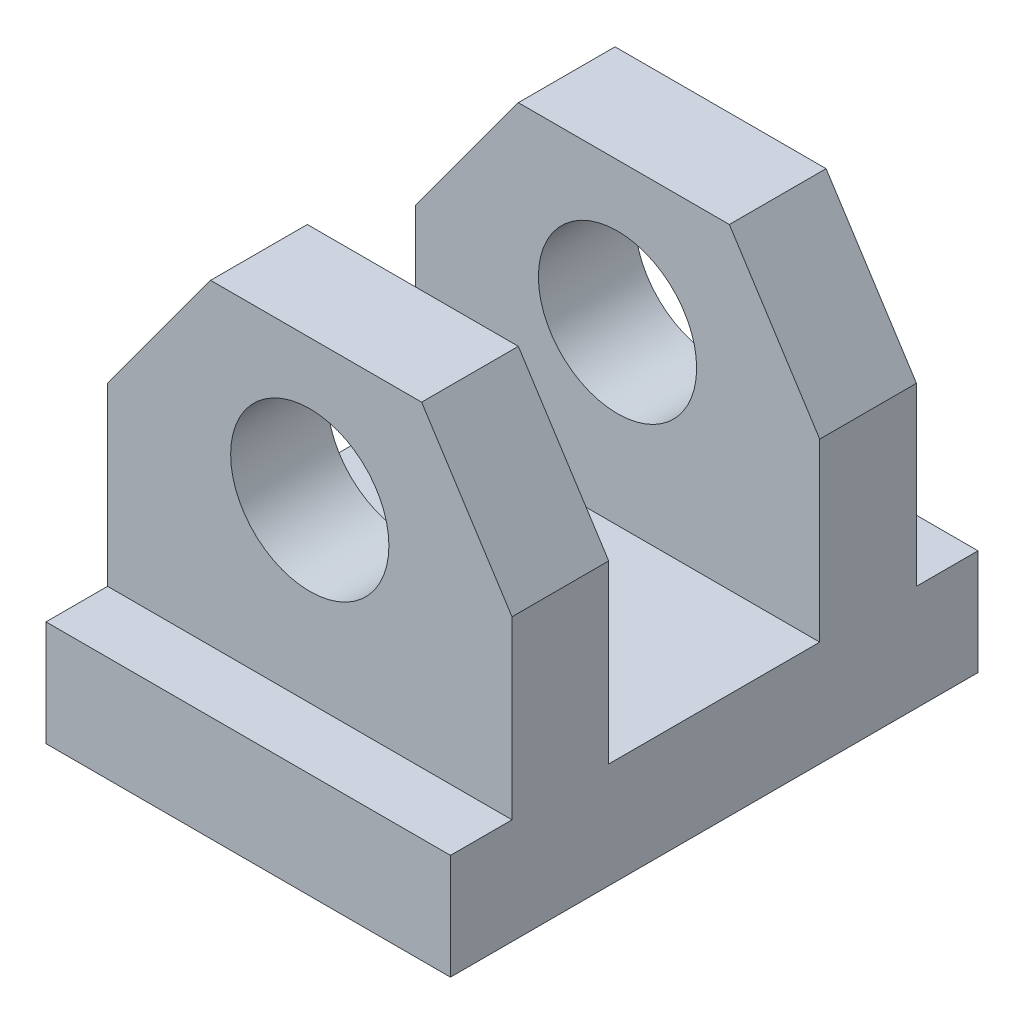
ISO-10303-21;
HEADER;
FILE_DESCRIPTION(('STEP AP214'),'2;1');
FILE_NAME('part.step','',(''),(''),'','','');
FILE_SCHEMA(('AUTOMOTIVE_DESIGN { 1 0 10303 214 1 1 1 1 }'));
ENDSEC;
DATA;
#1=APPLICATION_CONTEXT('core data for automotive mechanical design processes');
#2=APPLICATION_PROTOCOL_DEFINITION('international standard','automotive_design',2000,#1);
#3=PRODUCT_CONTEXT('',#1,'mechanical');
#4=PRODUCT('Part','Part','',(#3));
#5=PRODUCT_RELATED_PRODUCT_CATEGORY('part','',(#4));
#6=PRODUCT_DEFINITION_FORMATION('','',#4);
#7=PRODUCT_DEFINITION_CONTEXT('part definition',#1,'design');
#8=PRODUCT_DEFINITION('design','',#6,#7);
#9=PRODUCT_DEFINITION_SHAPE('','',#8);
#10=(LENGTH_UNIT() NAMED_UNIT(*) SI_UNIT(.MILLI.,.METRE.));
#11=(NAMED_UNIT(*) PLANE_ANGLE_UNIT() SI_UNIT($,.RADIAN.));
#12=(NAMED_UNIT(*) SI_UNIT($,.STERADIAN.) SOLID_ANGLE_UNIT());
#13=UNCERTAINTY_MEASURE_WITH_UNIT(LENGTH_MEASURE(1.E-05),#10,'distance_accuracy_value','');
#14=(GEOMETRIC_REPRESENTATION_CONTEXT(3) GLOBAL_UNCERTAINTY_ASSIGNED_CONTEXT((#13)) GLOBAL_UNIT_ASSIGNED_CONTEXT((#10,
#11,#12)) REPRESENTATION_CONTEXT('',''));
#15=CARTESIAN_POINT('',(0.,0.,0.));
#16=DIRECTION('',(0.,0.,1.));
#17=DIRECTION('',(1.,0.,0.));
#18=AXIS2_PLACEMENT_3D('',#15,#16,#17);
#19=CARTESIAN_POINT('',(-23.,32.,-60.));
#20=DIRECTION('',(-0.806704147310571,0.590955513310372,0.));
#21=DIRECTION('',(-0.590955513310372,-0.806704147310571,0.));
#22=AXIS2_PLACEMENT_3D('',#19,#20,#21);
#23=PLANE('',#22);
#24=DIRECTION('',(0.590955513310372,0.806704147310571,0.));
#25=VECTOR('',#24,1.);
#26=CARTESIAN_POINT('',(-23.,32.,-18.));
#27=LINE('',#26,#25);
#28=CARTESIAN_POINT('',(-23.,32.,-18.));
#29=VERTEX_POINT('',#28);
#30=CARTESIAN_POINT('',(-11.2791129257381,48.,-18.));
#31=VERTEX_POINT('',#30);
#32=EDGE_CURVE('E195',#29,#31,#27,.T.);
#33=ORIENTED_EDGE('',*,*,#32,.F.);
#34=DIRECTION('',(0.,0.,1.));
#35=VECTOR('',#34,1.);
#36=CARTESIAN_POINT('',(-23.,32.,-60.));
#37=LINE('',#36,#35);
#38=CARTESIAN_POINT('',(-23.,32.,-7.));
#39=VERTEX_POINT('',#38);
#40=EDGE_CURVE('E264',#29,#39,#37,.T.);
#41=ORIENTED_EDGE('',*,*,#40,.T.);
#42=DIRECTION('',(-0.590955513310372,-0.806704147310571,0.));
#43=VECTOR('',#42,1.);
#44=CARTESIAN_POINT('',(-23.,32.,-7.));
#45=LINE('',#44,#43);
#46=CARTESIAN_POINT('',(-11.2791129257381,48.,-7.));
#47=VERTEX_POINT('',#46);
#48=EDGE_CURVE('E240',#47,#39,#45,.T.);
#49=ORIENTED_EDGE('',*,*,#48,.F.);
#50=DIRECTION('',(0.,0.,1.));
#51=VECTOR('',#50,1.);
#52=CARTESIAN_POINT('',(-11.2791129257381,48.,-60.));
#53=LINE('',#52,#51);
#54=EDGE_CURVE('E268',#31,#47,#53,.T.);
#55=ORIENTED_EDGE('',*,*,#54,.F.);
#56=EDGE_LOOP('',(#33,#41,#49,#55));
#57=FACE_BOUND('',#56,.T.);
#58=ADVANCED_FACE('F39',(#57),#23,.T.);
#59=CARTESIAN_POINT('',(-11.2791129257381,48.,-60.));
#60=DIRECTION('',(0.,1.,0.));
#61=DIRECTION('',(0.,0.,1.));
#62=AXIS2_PLACEMENT_3D('',#59,#60,#61);
#63=PLANE('',#62);
#64=DIRECTION('',(1.,0.,0.));
#65=VECTOR('',#64,1.);
#66=CARTESIAN_POINT('',(24.6073425821908,48.,-18.));
#67=LINE('',#66,#65);
#68=CARTESIAN_POINT('',(12.7208870742619,48.,-18.));
#69=VERTEX_POINT('',#68);
#70=EDGE_CURVE('E162',#31,#69,#67,.T.);
#71=ORIENTED_EDGE('',*,*,#70,.F.);
#72=ORIENTED_EDGE('',*,*,#54,.T.);
#73=DIRECTION('',(-1.,0.,0.));
#74=VECTOR('',#73,1.);
#75=CARTESIAN_POINT('',(-23.,48.,-7.));
#76=LINE('',#75,#74);
#77=CARTESIAN_POINT('',(12.7208870742619,48.,-7.));
#78=VERTEX_POINT('',#77);
#79=EDGE_CURVE('E202',#78,#47,#76,.T.);
#80=ORIENTED_EDGE('',*,*,#79,.F.);
#81=DIRECTION('',(0.,0.,1.));
#82=VECTOR('',#81,1.);
#83=CARTESIAN_POINT('',(12.7208870742619,48.,-60.));
#84=LINE('',#83,#82);
#85=EDGE_CURVE('E272',#69,#78,#84,.T.);
#86=ORIENTED_EDGE('',*,*,#85,.F.);
#87=EDGE_LOOP('',(#71,#72,#80,#86));
#88=FACE_BOUND('',#87,.T.);
#89=ADVANCED_FACE('F296',(#88),#63,.T.);
#90=CARTESIAN_POINT('',(12.7208870742619,48.,-60.));
#91=DIRECTION('',(0.841336336508848,0.540511950718826,0.));
#92=DIRECTION('',(-0.540511950718826,0.841336336508848,0.));
#93=AXIS2_PLACEMENT_3D('',#90,#91,#92);
#94=PLANE('',#93);
#95=DIRECTION('',(0.540511950718826,-0.841336336508848,0.));
#96=VECTOR('',#95,1.);
#97=CARTESIAN_POINT('',(12.7208870742619,48.,-18.));
#98=LINE('',#97,#96);
#99=CARTESIAN_POINT('',(23.,32.,-18.));
#100=VERTEX_POINT('',#99);
#101=EDGE_CURVE('E191',#69,#100,#98,.T.);
#102=ORIENTED_EDGE('',*,*,#101,.F.);
#103=ORIENTED_EDGE('',*,*,#85,.T.);
#104=DIRECTION('',(-0.540511950718826,0.841336336508848,0.));
#105=VECTOR('',#104,1.);
#106=CARTESIAN_POINT('',(12.7208870742619,48.,-7.));
#107=LINE('',#106,#105);
#108=CARTESIAN_POINT('',(23.,32.,-7.));
#109=VERTEX_POINT('',#108);
#110=EDGE_CURVE('E237',#109,#78,#107,.T.);
#111=ORIENTED_EDGE('',*,*,#110,.F.);
#112=DIRECTION('',(0.,0.,1.));
#113=VECTOR('',#112,1.);
#114=CARTESIAN_POINT('',(23.,32.,-60.));
#115=LINE('',#114,#113);
#116=EDGE_CURVE('E253',#100,#109,#115,.T.);
#117=ORIENTED_EDGE('',*,*,#116,.F.);
#118=EDGE_LOOP('',(#102,#103,#111,#117));
#119=FACE_BOUND('',#118,.T.);
#120=ADVANCED_FACE('F304',(#119),#94,.T.);
#121=CARTESIAN_POINT('',(0.,32.,-60.));
#122=DIRECTION('',(0.,0.,1.));
#123=DIRECTION('',(1.,0.,0.));
#124=AXIS2_PLACEMENT_3D('',#121,#122,#123);
#125=CYLINDRICAL_SURFACE('',#124,9.);
#126=CARTESIAN_POINT('',(0.,32.,-18.));
#127=DIRECTION('',(0.,0.,1.));
#128=DIRECTION('',(1.,0.,0.));
#129=AXIS2_PLACEMENT_3D('',#126,#127,#128);
#130=CIRCLE('',#129,9.);
#131=CARTESIAN_POINT('',(9.,32.,-18.));
#132=VERTEX_POINT('',#131);
#133=EDGE_CURVE('E43',#132,#132,#130,.F.);
#134=ORIENTED_EDGE('',*,*,#133,.T.);
#135=EDGE_LOOP('',(#134));
#136=FACE_BOUND('',#135,.T.);
#137=CARTESIAN_POINT('',(0.,32.,-7.));
#138=DIRECTION('',(0.,0.,-1.));
#139=DIRECTION('',(-1.,0.,0.));
#140=AXIS2_PLACEMENT_3D('',#137,#138,#139);
#141=CIRCLE('',#140,9.);
#142=CARTESIAN_POINT('',(-9.,32.,-7.));
#143=VERTEX_POINT('',#142);
#144=EDGE_CURVE('E236',#143,#143,#141,.F.);
#145=ORIENTED_EDGE('',*,*,#144,.T.);
#146=EDGE_LOOP('',(#145));
#147=FACE_BOUND('',#146,.T.);
#148=ADVANCED_FACE('F370',(#136,#147),#125,.F.);
#149=CARTESIAN_POINT('',(0.,0.,-60.));
#150=DIRECTION('',(0.,0.,-1.));
#151=DIRECTION('',(-1.,0.,0.));
#152=AXIS2_PLACEMENT_3D('',#149,#150,#151);
#153=PLANE('',#152);
#154=DIRECTION('',(0.,-1.,0.));
#155=VECTOR('',#154,1.);
#156=CARTESIAN_POINT('',(-23.,0.,-60.));
#157=LINE('',#156,#155);
#158=CARTESIAN_POINT('',(-23.,12.,-60.));
#159=VERTEX_POINT('',#158);
#160=CARTESIAN_POINT('',(-23.,0.,-60.));
#161=VERTEX_POINT('',#160);
#162=EDGE_CURVE('E247',#159,#161,#157,.T.);
#163=ORIENTED_EDGE('',*,*,#162,.F.);
#164=DIRECTION('',(-1.,0.,0.));
#165=VECTOR('',#164,1.);
#166=CARTESIAN_POINT('',(-23.,12.,-60.));
#167=LINE('',#166,#165);
#168=CARTESIAN_POINT('',(23.,12.,-60.));
#169=VERTEX_POINT('',#168);
#170=EDGE_CURVE('E221',#169,#159,#167,.T.);
#171=ORIENTED_EDGE('',*,*,#170,.F.);
#172=DIRECTION('',(0.,1.,0.));
#173=VECTOR('',#172,1.);
#174=CARTESIAN_POINT('',(23.,0.,-60.));
#175=LINE('',#174,#173);
#176=CARTESIAN_POINT('',(23.,0.,-60.));
#177=VERTEX_POINT('',#176);
#178=EDGE_CURVE('E244',#177,#169,#175,.T.);
#179=ORIENTED_EDGE('',*,*,#178,.F.);
#180=DIRECTION('',(1.,0.,0.));
#181=VECTOR('',#180,1.);
#182=CARTESIAN_POINT('',(-23.,0.,-60.));
#183=LINE('',#182,#181);
#184=EDGE_CURVE('E250',#161,#177,#183,.T.);
#185=ORIENTED_EDGE('',*,*,#184,.F.);
#186=EDGE_LOOP('',(#163,#171,#179,#185));
#187=FACE_BOUND('',#186,.T.);
#188=ADVANCED_FACE('F339',(#187),#153,.T.);
#189=CARTESIAN_POINT('',(23.,0.,-60.));
#190=DIRECTION('',(1.,0.,0.));
#191=DIRECTION('',(0.,1.,0.));
#192=AXIS2_PLACEMENT_3D('',#189,#190,#191);
#193=PLANE('',#192);
#194=DIRECTION('',(0.,-1.,0.));
#195=VECTOR('',#194,1.);
#196=CARTESIAN_POINT('',(23.,0.,-18.));
#197=LINE('',#196,#195);
#198=CARTESIAN_POINT('',(23.,12.,-18.));
#199=VERTEX_POINT('',#198);
#200=EDGE_CURVE('E193',#100,#199,#197,.T.);
#201=ORIENTED_EDGE('',*,*,#200,.F.);
#202=ORIENTED_EDGE('',*,*,#116,.T.);
#203=DIRECTION('',(0.,1.,0.));
#204=VECTOR('',#203,1.);
#205=CARTESIAN_POINT('',(23.,12.,-7.));
#206=LINE('',#205,#204);
#207=CARTESIAN_POINT('',(23.,12.,-7.));
#208=VERTEX_POINT('',#207);
#209=EDGE_CURVE('E209',#208,#109,#206,.T.);
#210=ORIENTED_EDGE('',*,*,#209,.F.);
#211=DIRECTION('',(0.,0.,-1.));
#212=VECTOR('',#211,1.);
#213=CARTESIAN_POINT('',(23.,12.,0.));
#214=LINE('',#213,#212);
#215=CARTESIAN_POINT('',(23.,12.,0.));
#216=VERTEX_POINT('',#215);
#217=EDGE_CURVE('E204',#216,#208,#214,.T.);
#218=ORIENTED_EDGE('',*,*,#217,.F.);
#219=DIRECTION('',(0.,1.,0.));
#220=VECTOR('',#219,1.);
#221=CARTESIAN_POINT('',(23.,0.,0.));
#222=LINE('',#221,#220);
#223=CARTESIAN_POINT('',(23.,0.,0.));
#224=VERTEX_POINT('',#223);
#225=EDGE_CURVE('E243',#224,#216,#222,.T.);
#226=ORIENTED_EDGE('',*,*,#225,.F.);
#227=DIRECTION('',(0.,0.,1.));
#228=VECTOR('',#227,1.);
#229=CARTESIAN_POINT('',(23.,0.,-60.));
#230=LINE('',#229,#228);
#231=EDGE_CURVE('E11',#177,#224,#230,.T.);
#232=ORIENTED_EDGE('',*,*,#231,.F.);
#233=ORIENTED_EDGE('',*,*,#178,.T.);
#234=DIRECTION('',(0.,0.,-1.));
#235=VECTOR('',#234,1.);
#236=CARTESIAN_POINT('',(23.,12.,-60.));
#237=LINE('',#236,#235);
#238=CARTESIAN_POINT('',(23.,12.,-53.));
#239=VERTEX_POINT('',#238);
#240=EDGE_CURVE('E64',#239,#169,#237,.T.);
#241=ORIENTED_EDGE('',*,*,#240,.F.);
#242=DIRECTION('',(0.,1.,0.));
#243=VECTOR('',#242,1.);
#244=CARTESIAN_POINT('',(23.,12.,-53.));
#245=LINE('',#244,#243);
#246=CARTESIAN_POINT('',(23.,32.,-53.));
#247=VERTEX_POINT('',#246);
#248=EDGE_CURVE('E198',#239,#247,#245,.T.);
#249=ORIENTED_EDGE('',*,*,#248,.T.);
#250=CARTESIAN_POINT('',(23.,32.,-42.));
#251=VERTEX_POINT('',#250);
#252=EDGE_CURVE('E273',#247,#251,#115,.T.);
#253=ORIENTED_EDGE('',*,*,#252,.T.);
#254=DIRECTION('',(0.,1.,0.));
#255=VECTOR('',#254,1.);
#256=CARTESIAN_POINT('',(23.,0.,-42.));
#257=LINE('',#256,#255);
#258=CARTESIAN_POINT('',(23.,12.,-42.));
#259=VERTEX_POINT('',#258);
#260=EDGE_CURVE('E56',#259,#251,#257,.T.);
#261=ORIENTED_EDGE('',*,*,#260,.F.);
#262=DIRECTION('',(0.,0.,1.));
#263=VECTOR('',#262,1.);
#264=CARTESIAN_POINT('',(23.,12.,-60.));
#265=LINE('',#264,#263);
#266=EDGE_CURVE('E161',#259,#199,#265,.T.);
#267=ORIENTED_EDGE('',*,*,#266,.T.);
#268=EDGE_LOOP('',(#201,#202,#210,#218,#226,#232,#233,#241,#249,#253,#261,#267));
#269=FACE_BOUND('',#268,.T.);
#270=ADVANCED_FACE('F41',(#269),#193,.T.);
#271=CARTESIAN_POINT('',(-23.,0.,-60.));
#272=DIRECTION('',(0.,-1.,0.));
#273=DIRECTION('',(1.,0.,0.));
#274=AXIS2_PLACEMENT_3D('',#271,#272,#273);
#275=PLANE('',#274);
#276=DIRECTION('',(1.,0.,0.));
#277=VECTOR('',#276,1.);
#278=CARTESIAN_POINT('',(-23.,0.,0.));
#279=LINE('',#278,#277);
#280=CARTESIAN_POINT('',(-23.,0.,0.));
#281=VERTEX_POINT('',#280);
#282=EDGE_CURVE('E248',#281,#224,#279,.T.);
#283=ORIENTED_EDGE('',*,*,#282,.F.);
#284=DIRECTION('',(0.,0.,1.));
#285=VECTOR('',#284,1.);
#286=CARTESIAN_POINT('',(-23.,0.,-60.));
#287=LINE('',#286,#285);
#288=EDGE_CURVE('E48',#161,#281,#287,.T.);
#289=ORIENTED_EDGE('',*,*,#288,.F.);
#290=ORIENTED_EDGE('',*,*,#184,.T.);
#291=ORIENTED_EDGE('',*,*,#231,.T.);
#292=EDGE_LOOP('',(#283,#289,#290,#291));
#293=FACE_BOUND('',#292,.T.);
#294=ADVANCED_FACE('F318',(#293),#275,.T.);
#295=CARTESIAN_POINT('',(-23.,0.,-60.));
#296=DIRECTION('',(-1.,0.,0.));
#297=DIRECTION('',(0.,0.,1.));
#298=AXIS2_PLACEMENT_3D('',#295,#296,#297);
#299=PLANE('',#298);
#300=DIRECTION('',(0.,1.,0.));
#301=VECTOR('',#300,1.);
#302=CARTESIAN_POINT('',(-23.,12.,-18.));
#303=LINE('',#302,#301);
#304=CARTESIAN_POINT('',(-23.,12.,-18.));
#305=VERTEX_POINT('',#304);
#306=EDGE_CURVE('E173',#305,#29,#303,.T.);
#307=ORIENTED_EDGE('',*,*,#306,.F.);
#308=DIRECTION('',(0.,0.,1.));
#309=VECTOR('',#308,1.);
#310=CARTESIAN_POINT('',(-23.,12.,-18.));
#311=LINE('',#310,#309);
#312=CARTESIAN_POINT('',(-23.,12.,-42.));
#313=VERTEX_POINT('',#312);
#314=EDGE_CURVE('E158',#313,#305,#311,.T.);
#315=ORIENTED_EDGE('',*,*,#314,.F.);
#316=DIRECTION('',(0.,1.,0.));
#317=VECTOR('',#316,1.);
#318=CARTESIAN_POINT('',(-23.,12.,-42.));
#319=LINE('',#318,#317);
#320=CARTESIAN_POINT('',(-23.,32.,-42.));
#321=VERTEX_POINT('',#320);
#322=EDGE_CURVE('E165',#313,#321,#319,.T.);
#323=ORIENTED_EDGE('',*,*,#322,.T.);
#324=CARTESIAN_POINT('',(-23.,32.,-53.));
#325=VERTEX_POINT('',#324);
#326=EDGE_CURVE('E262',#325,#321,#37,.T.);
#327=ORIENTED_EDGE('',*,*,#326,.F.);
#328=DIRECTION('',(0.,1.,0.));
#329=VECTOR('',#328,1.);
#330=CARTESIAN_POINT('',(-23.,12.,-53.));
#331=LINE('',#330,#329);
#332=CARTESIAN_POINT('',(-23.,12.,-53.));
#333=VERTEX_POINT('',#332);
#334=EDGE_CURVE('E219',#333,#325,#331,.T.);
#335=ORIENTED_EDGE('',*,*,#334,.F.);
#336=DIRECTION('',(0.,0.,1.));
#337=VECTOR('',#336,1.);
#338=CARTESIAN_POINT('',(-23.,12.,-60.));
#339=LINE('',#338,#337);
#340=EDGE_CURVE('E225',#159,#333,#339,.T.);
#341=ORIENTED_EDGE('',*,*,#340,.F.);
#342=ORIENTED_EDGE('',*,*,#162,.T.);
#343=ORIENTED_EDGE('',*,*,#288,.T.);
#344=DIRECTION('',(0.,-1.,0.));
#345=VECTOR('',#344,1.);
#346=CARTESIAN_POINT('',(-23.,0.,0.));
#347=LINE('',#346,#345);
#348=CARTESIAN_POINT('',(-23.,12.,0.));
#349=VERTEX_POINT('',#348);
#350=EDGE_CURVE('E256',#349,#281,#347,.T.);
#351=ORIENTED_EDGE('',*,*,#350,.F.);
#352=DIRECTION('',(0.,0.,1.));
#353=VECTOR('',#352,1.);
#354=CARTESIAN_POINT('',(-23.,12.,0.));
#355=LINE('',#354,#353);
#356=CARTESIAN_POINT('',(-23.,12.,-7.));
#357=VERTEX_POINT('',#356);
#358=EDGE_CURVE('E199',#357,#349,#355,.T.);
#359=ORIENTED_EDGE('',*,*,#358,.F.);
#360=DIRECTION('',(0.,1.,0.));
#361=VECTOR('',#360,1.);
#362=CARTESIAN_POINT('',(-23.,12.,-7.));
#363=LINE('',#362,#361);
#364=EDGE_CURVE('E213',#357,#39,#363,.T.);
#365=ORIENTED_EDGE('',*,*,#364,.T.);
#366=ORIENTED_EDGE('',*,*,#40,.F.);
#367=EDGE_LOOP('',(#307,#315,#323,#327,#335,#341,#342,#343,#351,#359,#365,#366));
#368=FACE_BOUND('',#367,.T.);
#369=ADVANCED_FACE('F177',(#368),#299,.T.);
#370=DIRECTION('',(-0.590955513310372,-0.806704147310571,0.));
#371=VECTOR('',#370,1.);
#372=CARTESIAN_POINT('',(-23.,32.,-42.));
#373=LINE('',#372,#371);
#374=CARTESIAN_POINT('',(-11.2791129257381,48.,-42.));
#375=VERTEX_POINT('',#374);
#376=EDGE_CURVE('E169',#375,#321,#373,.T.);
#377=ORIENTED_EDGE('',*,*,#376,.F.);
#378=CARTESIAN_POINT('',(-11.2791129257381,48.,-53.));
#379=VERTEX_POINT('',#378);
#380=EDGE_CURVE('E265',#379,#375,#53,.T.);
#381=ORIENTED_EDGE('',*,*,#380,.F.);
#382=DIRECTION('',(0.590955513310372,0.806704147310571,0.));
#383=VECTOR('',#382,1.);
#384=CARTESIAN_POINT('',(-23.,32.,-53.));
#385=LINE('',#384,#383);
#386=EDGE_CURVE('E234',#325,#379,#385,.T.);
#387=ORIENTED_EDGE('',*,*,#386,.F.);
#388=ORIENTED_EDGE('',*,*,#326,.T.);
#389=EDGE_LOOP('',(#377,#381,#387,#388));
#390=FACE_BOUND('',#389,.T.);
#391=ADVANCED_FACE('F299',(#390),#23,.T.);
#392=DIRECTION('',(-1.,0.,0.));
#393=VECTOR('',#392,1.);
#394=CARTESIAN_POINT('',(24.6073425821908,48.,-42.));
#395=LINE('',#394,#393);
#396=CARTESIAN_POINT('',(12.7208870742619,48.,-42.));
#397=VERTEX_POINT('',#396);
#398=EDGE_CURVE('E182',#397,#375,#395,.T.);
#399=ORIENTED_EDGE('',*,*,#398,.F.);
#400=CARTESIAN_POINT('',(12.7208870742619,48.,-53.));
#401=VERTEX_POINT('',#400);
#402=EDGE_CURVE('E269',#401,#397,#84,.T.);
#403=ORIENTED_EDGE('',*,*,#402,.F.);
#404=DIRECTION('',(1.,0.,0.));
#405=VECTOR('',#404,1.);
#406=CARTESIAN_POINT('',(-23.,48.,-53.));
#407=LINE('',#406,#405);
#408=EDGE_CURVE('E212',#379,#401,#407,.T.);
#409=ORIENTED_EDGE('',*,*,#408,.F.);
#410=ORIENTED_EDGE('',*,*,#380,.T.);
#411=EDGE_LOOP('',(#399,#403,#409,#410));
#412=FACE_BOUND('',#411,.T.);
#413=ADVANCED_FACE('F307',(#412),#63,.T.);
#414=DIRECTION('',(-0.540511950718826,0.841336336508848,0.));
#415=VECTOR('',#414,1.);
#416=CARTESIAN_POINT('',(12.7208870742619,48.,-42.));
#417=LINE('',#416,#415);
#418=EDGE_CURVE('E187',#251,#397,#417,.T.);
#419=ORIENTED_EDGE('',*,*,#418,.F.);
#420=ORIENTED_EDGE('',*,*,#252,.F.);
#421=DIRECTION('',(0.540511950718826,-0.841336336508848,0.));
#422=VECTOR('',#421,1.);
#423=CARTESIAN_POINT('',(12.7208870742619,48.,-53.));
#424=LINE('',#423,#422);
#425=EDGE_CURVE('E232',#401,#247,#424,.T.);
#426=ORIENTED_EDGE('',*,*,#425,.F.);
#427=ORIENTED_EDGE('',*,*,#402,.T.);
#428=EDGE_LOOP('',(#419,#420,#426,#427));
#429=FACE_BOUND('',#428,.T.);
#430=ADVANCED_FACE('F316',(#429),#94,.T.);
#431=CARTESIAN_POINT('',(0.,0.,0.));
#432=DIRECTION('',(0.,0.,-1.));
#433=DIRECTION('',(-1.,0.,0.));
#434=AXIS2_PLACEMENT_3D('',#431,#432,#433);
#435=PLANE('',#434);
#436=ORIENTED_EDGE('',*,*,#225,.T.);
#437=DIRECTION('',(1.,0.,0.));
#438=VECTOR('',#437,1.);
#439=CARTESIAN_POINT('',(-23.,12.,0.));
#440=LINE('',#439,#438);
#441=EDGE_CURVE('E201',#349,#216,#440,.T.);
#442=ORIENTED_EDGE('',*,*,#441,.F.);
#443=ORIENTED_EDGE('',*,*,#350,.T.);
#444=ORIENTED_EDGE('',*,*,#282,.T.);
#445=EDGE_LOOP('',(#436,#442,#443,#444));
#446=FACE_BOUND('',#445,.T.);
#447=ADVANCED_FACE('F348',(#446),#435,.F.);
#448=CARTESIAN_POINT('',(-23.,12.,-53.));
#449=DIRECTION('',(0.,0.,1.));
#450=DIRECTION('',(1.,0.,0.));
#451=AXIS2_PLACEMENT_3D('',#448,#449,#450);
#452=PLANE('',#451);
#453=ORIENTED_EDGE('',*,*,#386,.T.);
#454=ORIENTED_EDGE('',*,*,#408,.T.);
#455=ORIENTED_EDGE('',*,*,#425,.T.);
#456=ORIENTED_EDGE('',*,*,#248,.F.);
#457=DIRECTION('',(1.,0.,0.));
#458=VECTOR('',#457,1.);
#459=CARTESIAN_POINT('',(-23.,12.,-53.));
#460=LINE('',#459,#458);
#461=EDGE_CURVE('E228',#333,#239,#460,.T.);
#462=ORIENTED_EDGE('',*,*,#461,.F.);
#463=ORIENTED_EDGE('',*,*,#334,.T.);
#464=EDGE_LOOP('',(#453,#454,#455,#456,#462,#463));
#465=FACE_BOUND('',#464,.T.);
#466=CARTESIAN_POINT('',(0.,32.,-53.));
#467=DIRECTION('',(0.,0.,1.));
#468=DIRECTION('',(1.,0.,0.));
#469=AXIS2_PLACEMENT_3D('',#466,#467,#468);
#470=CIRCLE('',#469,9.);
#471=CARTESIAN_POINT('',(9.,32.,-53.));
#472=VERTEX_POINT('',#471);
#473=EDGE_CURVE('E216',#472,#472,#470,.F.);
#474=ORIENTED_EDGE('',*,*,#473,.F.);
#475=EDGE_LOOP('',(#474));
#476=FACE_BOUND('',#475,.T.);
#477=ADVANCED_FACE('F326',(#465,#476),#452,.F.);
#478=CARTESIAN_POINT('',(0.,12.,0.));
#479=DIRECTION('',(0.,1.,0.));
#480=DIRECTION('',(0.,0.,1.));
#481=AXIS2_PLACEMENT_3D('',#478,#479,#480);
#482=PLANE('',#481);
#483=ORIENTED_EDGE('',*,*,#340,.T.);
#484=ORIENTED_EDGE('',*,*,#461,.T.);
#485=ORIENTED_EDGE('',*,*,#240,.T.);
#486=ORIENTED_EDGE('',*,*,#170,.T.);
#487=EDGE_LOOP('',(#483,#484,#485,#486));
#488=FACE_BOUND('',#487,.T.);
#489=ADVANCED_FACE('F332',(#488),#482,.T.);
#490=CARTESIAN_POINT('',(-23.,12.,-7.));
#491=DIRECTION('',(0.,0.,-1.));
#492=DIRECTION('',(-1.,0.,0.));
#493=AXIS2_PLACEMENT_3D('',#490,#491,#492);
#494=PLANE('',#493);
#495=ORIENTED_EDGE('',*,*,#48,.T.);
#496=ORIENTED_EDGE('',*,*,#364,.F.);
#497=DIRECTION('',(-1.,0.,0.));
#498=VECTOR('',#497,1.);
#499=CARTESIAN_POINT('',(-23.,12.,-7.));
#500=LINE('',#499,#498);
#501=EDGE_CURVE('E206',#208,#357,#500,.T.);
#502=ORIENTED_EDGE('',*,*,#501,.F.);
#503=ORIENTED_EDGE('',*,*,#209,.T.);
#504=ORIENTED_EDGE('',*,*,#110,.T.);
#505=ORIENTED_EDGE('',*,*,#79,.T.);
#506=EDGE_LOOP('',(#495,#496,#502,#503,#504,#505));
#507=FACE_BOUND('',#506,.T.);
#508=ORIENTED_EDGE('',*,*,#144,.F.);
#509=EDGE_LOOP('',(#508));
#510=FACE_BOUND('',#509,.T.);
#511=ADVANCED_FACE('F357',(#507,#510),#494,.F.);
#512=CARTESIAN_POINT('',(0.,12.,0.));
#513=DIRECTION('',(0.,-1.,0.));
#514=DIRECTION('',(0.,0.,-1.));
#515=AXIS2_PLACEMENT_3D('',#512,#513,#514);
#516=PLANE('',#515);
#517=ORIENTED_EDGE('',*,*,#358,.T.);
#518=ORIENTED_EDGE('',*,*,#441,.T.);
#519=ORIENTED_EDGE('',*,*,#217,.T.);
#520=ORIENTED_EDGE('',*,*,#501,.T.);
#521=EDGE_LOOP('',(#517,#518,#519,#520));
#522=FACE_BOUND('',#521,.T.);
#523=ADVANCED_FACE('F351',(#522),#516,.F.);
#524=CARTESIAN_POINT('',(0.,32.,-42.));
#525=DIRECTION('',(0.,0.,-1.));
#526=DIRECTION('',(-1.,0.,0.));
#527=AXIS2_PLACEMENT_3D('',#524,#525,#526);
#528=CIRCLE('',#527,9.);
#529=CARTESIAN_POINT('',(-9.,32.,-42.));
#530=VERTEX_POINT('',#529);
#531=EDGE_CURVE('E185',#530,#530,#528,.F.);
#532=ORIENTED_EDGE('',*,*,#531,.T.);
#533=EDGE_LOOP('',(#532));
#534=FACE_BOUND('',#533,.T.);
#535=ORIENTED_EDGE('',*,*,#473,.T.);
#536=EDGE_LOOP('',(#535));
#537=FACE_BOUND('',#536,.T.);
#538=ADVANCED_FACE('F282',(#534,#537),#125,.F.);
#539=CARTESIAN_POINT('',(24.6073425821908,12.,-18.));
#540=DIRECTION('',(0.,0.,1.));
#541=DIRECTION('',(1.,0.,0.));
#542=AXIS2_PLACEMENT_3D('',#539,#540,#541);
#543=PLANE('',#542);
#544=ORIENTED_EDGE('',*,*,#32,.T.);
#545=ORIENTED_EDGE('',*,*,#70,.T.);
#546=ORIENTED_EDGE('',*,*,#101,.T.);
#547=ORIENTED_EDGE('',*,*,#200,.T.);
#548=DIRECTION('',(1.,0.,0.));
#549=VECTOR('',#548,1.);
#550=CARTESIAN_POINT('',(24.6073425821908,12.,-18.));
#551=LINE('',#550,#549);
#552=EDGE_CURVE('E174',#305,#199,#551,.T.);
#553=ORIENTED_EDGE('',*,*,#552,.F.);
#554=ORIENTED_EDGE('',*,*,#306,.T.);
#555=EDGE_LOOP('',(#544,#545,#546,#547,#553,#554));
#556=FACE_BOUND('',#555,.T.);
#557=ORIENTED_EDGE('',*,*,#133,.F.);
#558=EDGE_LOOP('',(#557));
#559=FACE_BOUND('',#558,.T.);
#560=ADVANCED_FACE('F285',(#556,#559),#543,.F.);
#561=CARTESIAN_POINT('',(24.6073425821908,12.,-42.));
#562=DIRECTION('',(0.,0.,-1.));
#563=DIRECTION('',(-1.,0.,0.));
#564=AXIS2_PLACEMENT_3D('',#561,#562,#563);
#565=PLANE('',#564);
#566=ORIENTED_EDGE('',*,*,#376,.T.);
#567=ORIENTED_EDGE('',*,*,#322,.F.);
#568=DIRECTION('',(-1.,0.,0.));
#569=VECTOR('',#568,1.);
#570=CARTESIAN_POINT('',(24.6073425821908,12.,-42.));
#571=LINE('',#570,#569);
#572=EDGE_CURVE('E153',#259,#313,#571,.T.);
#573=ORIENTED_EDGE('',*,*,#572,.F.);
#574=ORIENTED_EDGE('',*,*,#260,.T.);
#575=ORIENTED_EDGE('',*,*,#418,.T.);
#576=ORIENTED_EDGE('',*,*,#398,.T.);
#577=EDGE_LOOP('',(#566,#567,#573,#574,#575,#576));
#578=FACE_BOUND('',#577,.T.);
#579=ORIENTED_EDGE('',*,*,#531,.F.);
#580=EDGE_LOOP('',(#579));
#581=FACE_BOUND('',#580,.T.);
#582=ADVANCED_FACE('F166',(#578,#581),#565,.F.);
#583=CARTESIAN_POINT('',(0.,12.,0.));
#584=DIRECTION('',(0.,1.,0.));
#585=DIRECTION('',(0.,0.,1.));
#586=AXIS2_PLACEMENT_3D('',#583,#584,#585);
#587=PLANE('',#586);
#588=ORIENTED_EDGE('',*,*,#572,.T.);
#589=ORIENTED_EDGE('',*,*,#314,.T.);
#590=ORIENTED_EDGE('',*,*,#552,.T.);
#591=ORIENTED_EDGE('',*,*,#266,.F.);
#592=EDGE_LOOP('',(#588,#589,#590,#591));
#593=FACE_BOUND('',#592,.T.);
#594=ADVANCED_FACE('F155',(#593),#587,.T.);
#595=CLOSED_SHELL('',(#58,#89,#120,#148,#188,#270,#294,#369,#391,#413,#430,#447,#477,#489,#511,
#523,#538,#560,#582,#594));
#596=MANIFOLD_SOLID_BREP('B2',#595);
#597=ADVANCED_BREP_SHAPE_REPRESENTATION('',(#18,#596),#14);
#598=SHAPE_DEFINITION_REPRESENTATION(#9,#597);
ENDSEC;
END-ISO-10303-21;
